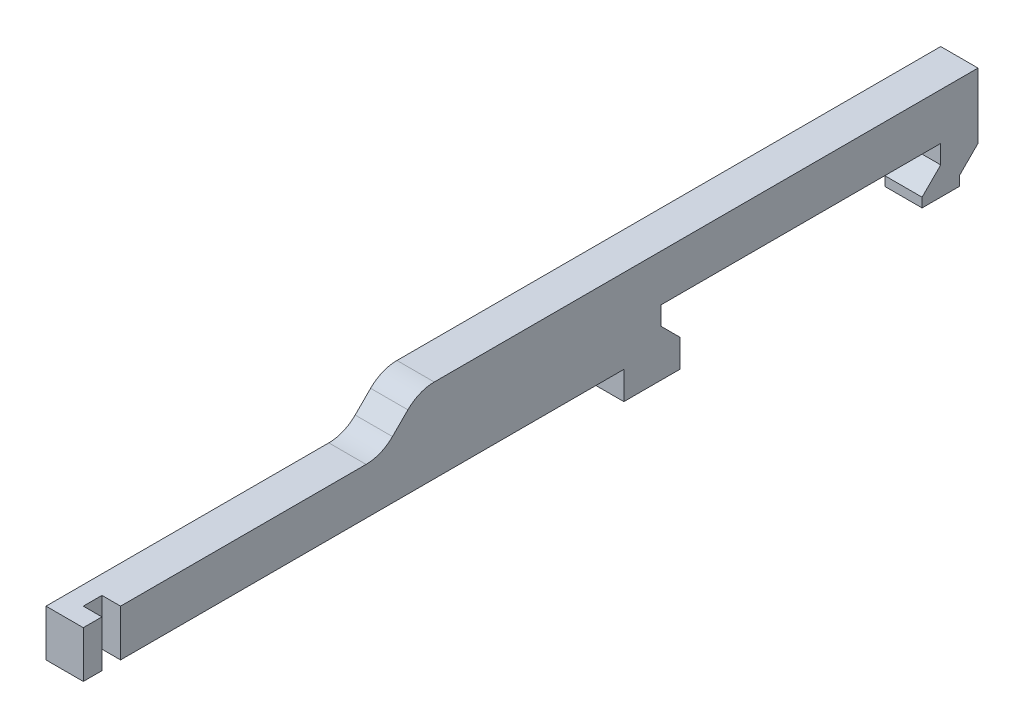
ISO-10303-21;
HEADER;
FILE_DESCRIPTION(('STEP AP214'),'2;1');
FILE_NAME('part.step','',(''),(''),'','','');
FILE_SCHEMA(('AUTOMOTIVE_DESIGN { 1 0 10303 214 1 1 1 1 }'));
ENDSEC;
DATA;
#1=APPLICATION_CONTEXT('core data for automotive mechanical design processes');
#2=APPLICATION_PROTOCOL_DEFINITION('international standard','automotive_design',2000,#1);
#3=PRODUCT_CONTEXT('',#1,'mechanical');
#4=PRODUCT('Part','Part','',(#3));
#5=PRODUCT_RELATED_PRODUCT_CATEGORY('part','',(#4));
#6=PRODUCT_DEFINITION_FORMATION('','',#4);
#7=PRODUCT_DEFINITION_CONTEXT('part definition',#1,'design');
#8=PRODUCT_DEFINITION('design','',#6,#7);
#9=PRODUCT_DEFINITION_SHAPE('','',#8);
#10=(LENGTH_UNIT() NAMED_UNIT(*) SI_UNIT(.MILLI.,.METRE.));
#11=(NAMED_UNIT(*) PLANE_ANGLE_UNIT() SI_UNIT($,.RADIAN.));
#12=(NAMED_UNIT(*) SI_UNIT($,.STERADIAN.) SOLID_ANGLE_UNIT());
#13=UNCERTAINTY_MEASURE_WITH_UNIT(LENGTH_MEASURE(1.E-05),#10,'distance_accuracy_value','');
#14=(GEOMETRIC_REPRESENTATION_CONTEXT(3) GLOBAL_UNCERTAINTY_ASSIGNED_CONTEXT((#13)) GLOBAL_UNIT_ASSIGNED_CONTEXT((#10,
#11,#12)) REPRESENTATION_CONTEXT('',''));
#15=CARTESIAN_POINT('',(0.,0.,0.));
#16=DIRECTION('',(0.,0.,1.));
#17=DIRECTION('',(1.,0.,0.));
#18=AXIS2_PLACEMENT_3D('',#15,#16,#17);
#19=CARTESIAN_POINT('',(2.,0.,0.));
#20=DIRECTION('',(1.,0.,0.));
#21=DIRECTION('',(0.,0.,-1.));
#22=AXIS2_PLACEMENT_3D('',#19,#20,#21);
#23=PLANE('',#22);
#24=DIRECTION('',(0.,-1.,0.));
#25=VECTOR('',#24,1.);
#26=CARTESIAN_POINT('',(2.,0.,-1.));
#27=LINE('',#26,#25);
#28=CARTESIAN_POINT('',(2.,2.5,-1.));
#29=VERTEX_POINT('',#28);
#30=CARTESIAN_POINT('',(2.,0.,-1.));
#31=VERTEX_POINT('',#30);
#32=EDGE_CURVE('E45',#29,#31,#27,.T.);
#33=ORIENTED_EDGE('',*,*,#32,.F.);
#34=DIRECTION('',(0.,0.,-1.));
#35=VECTOR('',#34,1.);
#36=CARTESIAN_POINT('',(2.,2.5,0.));
#37=LINE('',#36,#35);
#38=CARTESIAN_POINT('',(2.,2.5,0.));
#39=VERTEX_POINT('',#38);
#40=EDGE_CURVE('E216',#39,#29,#37,.T.);
#41=ORIENTED_EDGE('',*,*,#40,.F.);
#42=DIRECTION('',(0.,1.,0.));
#43=VECTOR('',#42,1.);
#44=CARTESIAN_POINT('',(2.,0.,0.));
#45=LINE('',#44,#43);
#46=CARTESIAN_POINT('',(2.,0.,0.));
#47=VERTEX_POINT('',#46);
#48=EDGE_CURVE('E220',#47,#39,#45,.T.);
#49=ORIENTED_EDGE('',*,*,#48,.F.);
#50=DIRECTION('',(0.,0.,-1.));
#51=VECTOR('',#50,1.);
#52=CARTESIAN_POINT('',(2.,0.,0.));
#53=LINE('',#52,#51);
#54=EDGE_CURVE('E229',#47,#31,#53,.T.);
#55=ORIENTED_EDGE('',*,*,#54,.T.);
#56=EDGE_LOOP('',(#33,#41,#49,#55));
#57=FACE_BOUND('',#56,.T.);
#58=ADVANCED_FACE('F37',(#57),#23,.T.);
#59=CARTESIAN_POINT('',(2.,0.,-48.));
#60=DIRECTION('',(0.,0.,1.));
#61=DIRECTION('',(1.,0.,0.));
#62=AXIS2_PLACEMENT_3D('',#59,#60,#61);
#63=PLANE('',#62);
#64=DIRECTION('',(0.,1.,0.));
#65=VECTOR('',#64,1.);
#66=CARTESIAN_POINT('',(0.,0.,-48.));
#67=LINE('',#66,#65);
#68=CARTESIAN_POINT('',(0.,0.999999999999997,-48.));
#69=VERTEX_POINT('',#68);
#70=CARTESIAN_POINT('',(0.,4.5,-48.));
#71=VERTEX_POINT('',#70);
#72=EDGE_CURVE('E259',#69,#71,#67,.T.);
#73=ORIENTED_EDGE('',*,*,#72,.T.);
#74=DIRECTION('',(-1.,0.,0.));
#75=VECTOR('',#74,1.);
#76=CARTESIAN_POINT('',(2.,4.5,-48.));
#77=LINE('',#76,#75);
#78=CARTESIAN_POINT('',(2.,4.5,-48.));
#79=VERTEX_POINT('',#78);
#80=EDGE_CURVE('E344',#79,#71,#77,.T.);
#81=ORIENTED_EDGE('',*,*,#80,.F.);
#82=DIRECTION('',(0.,1.,0.));
#83=VECTOR('',#82,1.);
#84=CARTESIAN_POINT('',(2.,0.,-48.));
#85=LINE('',#84,#83);
#86=CARTESIAN_POINT('',(2.,0.999999999999997,-48.));
#87=VERTEX_POINT('',#86);
#88=EDGE_CURVE('E304',#87,#79,#85,.T.);
#89=ORIENTED_EDGE('',*,*,#88,.F.);
#90=DIRECTION('',(-1.,0.,0.));
#91=VECTOR('',#90,1.);
#92=CARTESIAN_POINT('',(2.,0.999999999999997,-48.));
#93=LINE('',#92,#91);
#94=EDGE_CURVE('E258',#87,#69,#93,.T.);
#95=ORIENTED_EDGE('',*,*,#94,.T.);
#96=EDGE_LOOP('',(#73,#81,#89,#95));
#97=FACE_BOUND('',#96,.T.);
#98=ADVANCED_FACE('F431',(#97),#63,.F.);
#99=CARTESIAN_POINT('',(2.,4.5,0.));
#100=DIRECTION('',(0.,-1.,0.));
#101=DIRECTION('',(0.,0.,-1.));
#102=AXIS2_PLACEMENT_3D('',#99,#100,#101);
#103=PLANE('',#102);
#104=DIRECTION('',(0.,0.,1.));
#105=VECTOR('',#104,1.);
#106=CARTESIAN_POINT('',(0.,4.5,0.));
#107=LINE('',#106,#105);
#108=CARTESIAN_POINT('',(0.,4.5,-18.8284271247462));
#109=VERTEX_POINT('',#108);
#110=EDGE_CURVE('E262',#71,#109,#107,.T.);
#111=ORIENTED_EDGE('',*,*,#110,.T.);
#112=DIRECTION('',(-1.,0.,0.));
#113=VECTOR('',#112,1.);
#114=CARTESIAN_POINT('',(2.,4.5,-18.8284271247462));
#115=LINE('',#114,#113);
#116=CARTESIAN_POINT('',(2.,4.5,-18.8284271247462));
#117=VERTEX_POINT('',#116);
#118=EDGE_CURVE('E354',#109,#117,#115,.F.);
#119=ORIENTED_EDGE('',*,*,#118,.T.);
#120=DIRECTION('',(0.,0.,1.));
#121=VECTOR('',#120,1.);
#122=CARTESIAN_POINT('',(2.,4.5,0.));
#123=LINE('',#122,#121);
#124=EDGE_CURVE('E222',#79,#117,#123,.T.);
#125=ORIENTED_EDGE('',*,*,#124,.F.);
#126=ORIENTED_EDGE('',*,*,#80,.T.);
#127=EDGE_LOOP('',(#111,#119,#125,#126));
#128=FACE_BOUND('',#127,.T.);
#129=ADVANCED_FACE('F438',(#128),#103,.F.);
#130=CARTESIAN_POINT('',(2.,-6.75,-6.74999999999999));
#131=DIRECTION('',(0.,0.707106781186548,0.707106781186547));
#132=DIRECTION('',(0.,-0.707106781186547,0.707106781186548));
#133=AXIS2_PLACEMENT_3D('',#130,#131,#132);
#134=PLANE('',#133);
#135=DIRECTION('',(0.,0.707106781186547,-0.707106781186548));
#136=VECTOR('',#135,1.);
#137=CARTESIAN_POINT('',(2.,-6.75,-6.74999999999999));
#138=LINE('',#137,#136);
#139=CARTESIAN_POINT('',(2.,3.0857864376269,-16.5857864376269));
#140=VERTEX_POINT('',#139);
#141=CARTESIAN_POINT('',(2.,3.91421356237309,-17.4142135623731));
#142=VERTEX_POINT('',#141);
#143=EDGE_CURVE('E217',#140,#142,#138,.T.);
#144=ORIENTED_EDGE('',*,*,#143,.T.);
#145=DIRECTION('',(-1.,0.,0.));
#146=VECTOR('',#145,1.);
#147=CARTESIAN_POINT('',(0.,3.91421356237309,-17.4142135623731));
#148=LINE('',#147,#146);
#149=CARTESIAN_POINT('',(0.,3.91421356237309,-17.4142135623731));
#150=VERTEX_POINT('',#149);
#151=EDGE_CURVE('E349',#142,#150,#148,.T.);
#152=ORIENTED_EDGE('',*,*,#151,.T.);
#153=DIRECTION('',(0.,0.707106781186547,-0.707106781186548));
#154=VECTOR('',#153,1.);
#155=CARTESIAN_POINT('',(0.,-6.75,-6.74999999999999));
#156=LINE('',#155,#154);
#157=CARTESIAN_POINT('',(0.,3.0857864376269,-16.5857864376269));
#158=VERTEX_POINT('',#157);
#159=EDGE_CURVE('E266',#158,#150,#156,.T.);
#160=ORIENTED_EDGE('',*,*,#159,.F.);
#161=DIRECTION('',(-1.,0.,0.));
#162=VECTOR('',#161,1.);
#163=CARTESIAN_POINT('',(2.,3.0857864376269,-16.5857864376269));
#164=LINE('',#163,#162);
#165=EDGE_CURVE('E347',#158,#140,#164,.F.);
#166=ORIENTED_EDGE('',*,*,#165,.T.);
#167=EDGE_LOOP('',(#144,#152,#160,#166));
#168=FACE_BOUND('',#167,.T.);
#169=ADVANCED_FACE('F414',(#168),#134,.T.);
#170=CARTESIAN_POINT('',(2.,2.5,0.));
#171=DIRECTION('',(0.,1.,0.));
#172=DIRECTION('',(0.,0.,1.));
#173=AXIS2_PLACEMENT_3D('',#170,#171,#172);
#174=PLANE('',#173);
#175=DIRECTION('',(1.,0.,0.));
#176=VECTOR('',#175,1.);
#177=CARTESIAN_POINT('',(2.,2.5,-1.));
#178=LINE('',#177,#176);
#179=CARTESIAN_POINT('',(1.,2.5,-1.));
#180=VERTEX_POINT('',#179);
#181=EDGE_CURVE('E367',#180,#29,#178,.T.);
#182=ORIENTED_EDGE('',*,*,#181,.F.);
#183=DIRECTION('',(0.,0.,1.));
#184=VECTOR('',#183,1.);
#185=CARTESIAN_POINT('',(1.,2.5,-1.));
#186=LINE('',#185,#184);
#187=CARTESIAN_POINT('',(1.,2.5,-2.));
#188=VERTEX_POINT('',#187);
#189=EDGE_CURVE('E210',#188,#180,#186,.T.);
#190=ORIENTED_EDGE('',*,*,#189,.F.);
#191=DIRECTION('',(-1.,0.,0.));
#192=VECTOR('',#191,1.);
#193=CARTESIAN_POINT('',(2.,2.5,-2.));
#194=LINE('',#193,#192);
#195=CARTESIAN_POINT('',(2.,2.5,-2.));
#196=VERTEX_POINT('',#195);
#197=EDGE_CURVE('E201',#196,#188,#194,.T.);
#198=ORIENTED_EDGE('',*,*,#197,.F.);
#199=CARTESIAN_POINT('',(2.,2.5,-15.1715728752538));
#200=VERTEX_POINT('',#199);
#201=EDGE_CURVE('E60',#196,#200,#37,.T.);
#202=ORIENTED_EDGE('',*,*,#201,.T.);
#203=DIRECTION('',(-1.,0.,0.));
#204=VECTOR('',#203,1.);
#205=CARTESIAN_POINT('',(0.,2.5,-15.1715728752538));
#206=LINE('',#205,#204);
#207=CARTESIAN_POINT('',(0.,2.5,-15.1715728752538));
#208=VERTEX_POINT('',#207);
#209=EDGE_CURVE('E358',#200,#208,#206,.T.);
#210=ORIENTED_EDGE('',*,*,#209,.T.);
#211=DIRECTION('',(0.,0.,-1.));
#212=VECTOR('',#211,1.);
#213=CARTESIAN_POINT('',(0.,2.5,0.));
#214=LINE('',#213,#212);
#215=CARTESIAN_POINT('',(0.,2.5,0.));
#216=VERTEX_POINT('',#215);
#217=EDGE_CURVE('E269',#216,#208,#214,.T.);
#218=ORIENTED_EDGE('',*,*,#217,.F.);
#219=DIRECTION('',(-1.,0.,0.));
#220=VECTOR('',#219,1.);
#221=CARTESIAN_POINT('',(2.,2.5,0.));
#222=LINE('',#221,#220);
#223=EDGE_CURVE('E342',#39,#216,#222,.T.);
#224=ORIENTED_EDGE('',*,*,#223,.F.);
#225=ORIENTED_EDGE('',*,*,#40,.T.);
#226=EDGE_LOOP('',(#182,#190,#198,#202,#210,#218,#224,#225));
#227=FACE_BOUND('',#226,.T.);
#228=ADVANCED_FACE('F208',(#227),#174,.T.);
#229=CARTESIAN_POINT('',(2.,0.,0.));
#230=DIRECTION('',(0.,0.,1.));
#231=DIRECTION('',(1.,0.,0.));
#232=AXIS2_PLACEMENT_3D('',#229,#230,#231);
#233=PLANE('',#232);
#234=DIRECTION('',(0.,1.,0.));
#235=VECTOR('',#234,1.);
#236=CARTESIAN_POINT('',(0.,0.,0.));
#237=LINE('',#236,#235);
#238=CARTESIAN_POINT('',(0.,0.,0.));
#239=VERTEX_POINT('',#238);
#240=EDGE_CURVE('E272',#239,#216,#237,.T.);
#241=ORIENTED_EDGE('',*,*,#240,.F.);
#242=DIRECTION('',(-1.,0.,0.));
#243=VECTOR('',#242,1.);
#244=CARTESIAN_POINT('',(2.,0.,0.));
#245=LINE('',#244,#243);
#246=EDGE_CURVE('E340',#47,#239,#245,.T.);
#247=ORIENTED_EDGE('',*,*,#246,.F.);
#248=ORIENTED_EDGE('',*,*,#48,.T.);
#249=ORIENTED_EDGE('',*,*,#223,.T.);
#250=EDGE_LOOP('',(#241,#247,#248,#249));
#251=FACE_BOUND('',#250,.T.);
#252=ADVANCED_FACE('F377',(#251),#233,.T.);
#253=CARTESIAN_POINT('',(2.,0.,0.));
#254=DIRECTION('',(0.,1.,0.));
#255=DIRECTION('',(0.,0.,1.));
#256=AXIS2_PLACEMENT_3D('',#253,#254,#255);
#257=PLANE('',#256);
#258=DIRECTION('',(0.,0.,1.));
#259=VECTOR('',#258,1.);
#260=CARTESIAN_POINT('',(1.,0.,0.));
#261=LINE('',#260,#259);
#262=CARTESIAN_POINT('',(1.,0.,-2.));
#263=VERTEX_POINT('',#262);
#264=CARTESIAN_POINT('',(1.,0.,-1.));
#265=VERTEX_POINT('',#264);
#266=EDGE_CURVE('E11',#263,#265,#261,.T.);
#267=ORIENTED_EDGE('',*,*,#266,.T.);
#268=DIRECTION('',(1.,0.,0.));
#269=VECTOR('',#268,1.);
#270=CARTESIAN_POINT('',(2.,0.,-1.));
#271=LINE('',#270,#269);
#272=EDGE_CURVE('E263',#265,#31,#271,.T.);
#273=ORIENTED_EDGE('',*,*,#272,.T.);
#274=ORIENTED_EDGE('',*,*,#54,.F.);
#275=ORIENTED_EDGE('',*,*,#246,.T.);
#276=DIRECTION('',(0.,0.,-1.));
#277=VECTOR('',#276,1.);
#278=CARTESIAN_POINT('',(0.,0.,0.));
#279=LINE('',#278,#277);
#280=CARTESIAN_POINT('',(0.,0.,-29.));
#281=VERTEX_POINT('',#280);
#282=EDGE_CURVE('E275',#239,#281,#279,.T.);
#283=ORIENTED_EDGE('',*,*,#282,.T.);
#284=DIRECTION('',(-1.,0.,0.));
#285=VECTOR('',#284,1.);
#286=CARTESIAN_POINT('',(2.,0.,-29.));
#287=LINE('',#286,#285);
#288=CARTESIAN_POINT('',(2.,0.,-29.));
#289=VERTEX_POINT('',#288);
#290=EDGE_CURVE('E337',#289,#281,#287,.T.);
#291=ORIENTED_EDGE('',*,*,#290,.F.);
#292=CARTESIAN_POINT('',(2.,0.,-2.));
#293=VERTEX_POINT('',#292);
#294=EDGE_CURVE('E228',#293,#289,#53,.T.);
#295=ORIENTED_EDGE('',*,*,#294,.F.);
#296=DIRECTION('',(-1.,0.,0.));
#297=VECTOR('',#296,1.);
#298=CARTESIAN_POINT('',(2.,0.,-2.));
#299=LINE('',#298,#297);
#300=EDGE_CURVE('E52',#293,#263,#299,.T.);
#301=ORIENTED_EDGE('',*,*,#300,.T.);
#302=EDGE_LOOP('',(#267,#273,#274,#275,#283,#291,#295,#301));
#303=FACE_BOUND('',#302,.T.);
#304=ADVANCED_FACE('F372',(#303),#257,.F.);
#305=CARTESIAN_POINT('',(2.,0.,-29.));
#306=DIRECTION('',(0.,0.,-1.));
#307=DIRECTION('',(-1.,0.,0.));
#308=AXIS2_PLACEMENT_3D('',#305,#306,#307);
#309=PLANE('',#308);
#310=DIRECTION('',(0.,-1.,0.));
#311=VECTOR('',#310,1.);
#312=CARTESIAN_POINT('',(0.,0.,-29.));
#313=LINE('',#312,#311);
#314=CARTESIAN_POINT('',(0.,-1.5,-29.));
#315=VERTEX_POINT('',#314);
#316=EDGE_CURVE('E277',#281,#315,#313,.T.);
#317=ORIENTED_EDGE('',*,*,#316,.T.);
#318=DIRECTION('',(-1.,0.,0.));
#319=VECTOR('',#318,1.);
#320=CARTESIAN_POINT('',(2.,-1.5,-29.));
#321=LINE('',#320,#319);
#322=CARTESIAN_POINT('',(2.,-1.5,-29.));
#323=VERTEX_POINT('',#322);
#324=EDGE_CURVE('E334',#323,#315,#321,.T.);
#325=ORIENTED_EDGE('',*,*,#324,.F.);
#326=DIRECTION('',(0.,-1.,0.));
#327=VECTOR('',#326,1.);
#328=CARTESIAN_POINT('',(2.,0.,-29.));
#329=LINE('',#328,#327);
#330=EDGE_CURVE('E232',#289,#323,#329,.T.);
#331=ORIENTED_EDGE('',*,*,#330,.F.);
#332=ORIENTED_EDGE('',*,*,#290,.T.);
#333=EDGE_LOOP('',(#317,#325,#331,#332));
#334=FACE_BOUND('',#333,.T.);
#335=ADVANCED_FACE('F388',(#334),#309,.F.);
#336=CARTESIAN_POINT('',(2.,-1.5,0.));
#337=DIRECTION('',(0.,1.,0.));
#338=DIRECTION('',(0.,0.,1.));
#339=AXIS2_PLACEMENT_3D('',#336,#337,#338);
#340=PLANE('',#339);
#341=DIRECTION('',(0.,0.,-1.));
#342=VECTOR('',#341,1.);
#343=CARTESIAN_POINT('',(0.,-1.5,0.));
#344=LINE('',#343,#342);
#345=CARTESIAN_POINT('',(0.,-1.5,-32.));
#346=VERTEX_POINT('',#345);
#347=EDGE_CURVE('E279',#315,#346,#344,.T.);
#348=ORIENTED_EDGE('',*,*,#347,.T.);
#349=DIRECTION('',(-1.,0.,0.));
#350=VECTOR('',#349,1.);
#351=CARTESIAN_POINT('',(2.,-1.5,-32.));
#352=LINE('',#351,#350);
#353=CARTESIAN_POINT('',(2.,-1.5,-32.));
#354=VERTEX_POINT('',#353);
#355=EDGE_CURVE('E331',#354,#346,#352,.T.);
#356=ORIENTED_EDGE('',*,*,#355,.F.);
#357=DIRECTION('',(0.,0.,-1.));
#358=VECTOR('',#357,1.);
#359=CARTESIAN_POINT('',(2.,-1.5,0.));
#360=LINE('',#359,#358);
#361=EDGE_CURVE('E234',#323,#354,#360,.T.);
#362=ORIENTED_EDGE('',*,*,#361,.F.);
#363=ORIENTED_EDGE('',*,*,#324,.T.);
#364=EDGE_LOOP('',(#348,#356,#362,#363));
#365=FACE_BOUND('',#364,.T.);
#366=ADVANCED_FACE('F392',(#365),#340,.F.);
#367=CARTESIAN_POINT('',(2.,0.,-32.));
#368=DIRECTION('',(0.,0.,1.));
#369=DIRECTION('',(1.,0.,0.));
#370=AXIS2_PLACEMENT_3D('',#367,#368,#369);
#371=PLANE('',#370);
#372=DIRECTION('',(0.,1.,0.));
#373=VECTOR('',#372,1.);
#374=CARTESIAN_POINT('',(0.,0.,-32.));
#375=LINE('',#374,#373);
#376=CARTESIAN_POINT('',(0.,0.,-32.));
#377=VERTEX_POINT('',#376);
#378=EDGE_CURVE('E281',#346,#377,#375,.T.);
#379=ORIENTED_EDGE('',*,*,#378,.T.);
#380=DIRECTION('',(-1.,0.,0.));
#381=VECTOR('',#380,1.);
#382=CARTESIAN_POINT('',(2.,0.,-32.));
#383=LINE('',#382,#381);
#384=CARTESIAN_POINT('',(2.,0.,-32.));
#385=VERTEX_POINT('',#384);
#386=EDGE_CURVE('E328',#385,#377,#383,.T.);
#387=ORIENTED_EDGE('',*,*,#386,.F.);
#388=DIRECTION('',(0.,1.,0.));
#389=VECTOR('',#388,1.);
#390=CARTESIAN_POINT('',(2.,0.,-32.));
#391=LINE('',#390,#389);
#392=EDGE_CURVE('E236',#354,#385,#391,.T.);
#393=ORIENTED_EDGE('',*,*,#392,.F.);
#394=ORIENTED_EDGE('',*,*,#355,.T.);
#395=EDGE_LOOP('',(#379,#387,#393,#394));
#396=FACE_BOUND('',#395,.T.);
#397=ADVANCED_FACE('F485',(#396),#371,.F.);
#398=CARTESIAN_POINT('',(2.,16.,-16.));
#399=DIRECTION('',(0.,-0.707106781186548,0.707106781186547));
#400=DIRECTION('',(0.,-0.707106781186547,-0.707106781186548));
#401=AXIS2_PLACEMENT_3D('',#398,#399,#400);
#402=PLANE('',#401);
#403=DIRECTION('',(0.,0.707106781186547,0.707106781186548));
#404=VECTOR('',#403,1.);
#405=CARTESIAN_POINT('',(0.,16.,-16.));
#406=LINE('',#405,#404);
#407=CARTESIAN_POINT('',(0.,1.,-31.));
#408=VERTEX_POINT('',#407);
#409=EDGE_CURVE('E283',#377,#408,#406,.T.);
#410=ORIENTED_EDGE('',*,*,#409,.T.);
#411=DIRECTION('',(-1.,0.,0.));
#412=VECTOR('',#411,1.);
#413=CARTESIAN_POINT('',(2.,1.,-31.));
#414=LINE('',#413,#412);
#415=CARTESIAN_POINT('',(2.,1.,-31.));
#416=VERTEX_POINT('',#415);
#417=EDGE_CURVE('E325',#416,#408,#414,.T.);
#418=ORIENTED_EDGE('',*,*,#417,.F.);
#419=DIRECTION('',(0.,0.707106781186547,0.707106781186548));
#420=VECTOR('',#419,1.);
#421=CARTESIAN_POINT('',(2.,16.,-16.));
#422=LINE('',#421,#420);
#423=EDGE_CURVE('E238',#385,#416,#422,.T.);
#424=ORIENTED_EDGE('',*,*,#423,.F.);
#425=ORIENTED_EDGE('',*,*,#386,.T.);
#426=EDGE_LOOP('',(#410,#418,#424,#425));
#427=FACE_BOUND('',#426,.T.);
#428=ADVANCED_FACE('F481',(#427),#402,.F.);
#429=CARTESIAN_POINT('',(2.,0.,-31.));
#430=DIRECTION('',(0.,0.,1.));
#431=DIRECTION('',(1.,0.,0.));
#432=AXIS2_PLACEMENT_3D('',#429,#430,#431);
#433=PLANE('',#432);
#434=DIRECTION('',(0.,1.,0.));
#435=VECTOR('',#434,1.);
#436=CARTESIAN_POINT('',(0.,0.,-31.));
#437=LINE('',#436,#435);
#438=CARTESIAN_POINT('',(0.,2.,-31.));
#439=VERTEX_POINT('',#438);
#440=EDGE_CURVE('E285',#408,#439,#437,.T.);
#441=ORIENTED_EDGE('',*,*,#440,.T.);
#442=DIRECTION('',(-1.,0.,0.));
#443=VECTOR('',#442,1.);
#444=CARTESIAN_POINT('',(2.,2.,-31.));
#445=LINE('',#444,#443);
#446=CARTESIAN_POINT('',(2.,2.,-31.));
#447=VERTEX_POINT('',#446);
#448=EDGE_CURVE('E322',#447,#439,#445,.T.);
#449=ORIENTED_EDGE('',*,*,#448,.F.);
#450=DIRECTION('',(0.,1.,0.));
#451=VECTOR('',#450,1.);
#452=CARTESIAN_POINT('',(2.,0.,-31.));
#453=LINE('',#452,#451);
#454=EDGE_CURVE('E240',#416,#447,#453,.T.);
#455=ORIENTED_EDGE('',*,*,#454,.F.);
#456=ORIENTED_EDGE('',*,*,#417,.T.);
#457=EDGE_LOOP('',(#441,#449,#455,#456));
#458=FACE_BOUND('',#457,.T.);
#459=ADVANCED_FACE('F477',(#458),#433,.F.);
#460=CARTESIAN_POINT('',(2.,2.,0.));
#461=DIRECTION('',(0.,1.,0.));
#462=DIRECTION('',(0.,0.,1.));
#463=AXIS2_PLACEMENT_3D('',#460,#461,#462);
#464=PLANE('',#463);
#465=DIRECTION('',(0.,0.,-1.));
#466=VECTOR('',#465,1.);
#467=CARTESIAN_POINT('',(0.,2.,0.));
#468=LINE('',#467,#466);
#469=CARTESIAN_POINT('',(0.,2.,-46.));
#470=VERTEX_POINT('',#469);
#471=EDGE_CURVE('E287',#439,#470,#468,.T.);
#472=ORIENTED_EDGE('',*,*,#471,.T.);
#473=DIRECTION('',(-1.,0.,0.));
#474=VECTOR('',#473,1.);
#475=CARTESIAN_POINT('',(2.,2.,-46.));
#476=LINE('',#475,#474);
#477=CARTESIAN_POINT('',(2.,2.,-46.));
#478=VERTEX_POINT('',#477);
#479=EDGE_CURVE('E320',#478,#470,#476,.T.);
#480=ORIENTED_EDGE('',*,*,#479,.F.);
#481=DIRECTION('',(0.,0.,-1.));
#482=VECTOR('',#481,1.);
#483=CARTESIAN_POINT('',(2.,2.,0.));
#484=LINE('',#483,#482);
#485=EDGE_CURVE('E242',#447,#478,#484,.T.);
#486=ORIENTED_EDGE('',*,*,#485,.F.);
#487=ORIENTED_EDGE('',*,*,#448,.T.);
#488=EDGE_LOOP('',(#472,#480,#486,#487));
#489=FACE_BOUND('',#488,.T.);
#490=ADVANCED_FACE('F473',(#489),#464,.F.);
#491=CARTESIAN_POINT('',(2.,0.,-46.));
#492=DIRECTION('',(0.,0.,1.));
#493=DIRECTION('',(1.,0.,0.));
#494=AXIS2_PLACEMENT_3D('',#491,#492,#493);
#495=PLANE('',#494);
#496=DIRECTION('',(0.,1.,0.));
#497=VECTOR('',#496,1.);
#498=CARTESIAN_POINT('',(0.,0.,-46.));
#499=LINE('',#498,#497);
#500=CARTESIAN_POINT('',(0.,1.,-46.));
#501=VERTEX_POINT('',#500);
#502=EDGE_CURVE('E290',#501,#470,#499,.T.);
#503=ORIENTED_EDGE('',*,*,#502,.F.);
#504=DIRECTION('',(-1.,0.,0.));
#505=VECTOR('',#504,1.);
#506=CARTESIAN_POINT('',(2.,1.,-46.));
#507=LINE('',#506,#505);
#508=CARTESIAN_POINT('',(2.,1.,-46.));
#509=VERTEX_POINT('',#508);
#510=EDGE_CURVE('E318',#509,#501,#507,.T.);
#511=ORIENTED_EDGE('',*,*,#510,.F.);
#512=DIRECTION('',(0.,1.,0.));
#513=VECTOR('',#512,1.);
#514=CARTESIAN_POINT('',(2.,0.,-46.));
#515=LINE('',#514,#513);
#516=EDGE_CURVE('E244',#509,#478,#515,.T.);
#517=ORIENTED_EDGE('',*,*,#516,.T.);
#518=ORIENTED_EDGE('',*,*,#479,.T.);
#519=EDGE_LOOP('',(#503,#511,#517,#518));
#520=FACE_BOUND('',#519,.T.);
#521=ADVANCED_FACE('F469',(#520),#495,.T.);
#522=CARTESIAN_POINT('',(2.,-22.5,-22.5));
#523=DIRECTION('',(0.,0.707106781186547,0.707106781186547));
#524=DIRECTION('',(0.,-0.707106781186548,0.707106781186548));
#525=AXIS2_PLACEMENT_3D('',#522,#523,#524);
#526=PLANE('',#525);
#527=DIRECTION('',(0.,0.707106781186548,-0.707106781186548));
#528=VECTOR('',#527,1.);
#529=CARTESIAN_POINT('',(0.,-22.5,-22.5));
#530=LINE('',#529,#528);
#531=CARTESIAN_POINT('',(0.,0.,-45.));
#532=VERTEX_POINT('',#531);
#533=EDGE_CURVE('E293',#532,#501,#530,.T.);
#534=ORIENTED_EDGE('',*,*,#533,.F.);
#535=DIRECTION('',(-1.,0.,0.));
#536=VECTOR('',#535,1.);
#537=CARTESIAN_POINT('',(2.,0.,-45.));
#538=LINE('',#537,#536);
#539=CARTESIAN_POINT('',(2.,0.,-45.));
#540=VERTEX_POINT('',#539);
#541=EDGE_CURVE('E316',#540,#532,#538,.T.);
#542=ORIENTED_EDGE('',*,*,#541,.F.);
#543=DIRECTION('',(0.,0.707106781186548,-0.707106781186548));
#544=VECTOR('',#543,1.);
#545=CARTESIAN_POINT('',(2.,-22.5,-22.5));
#546=LINE('',#545,#544);
#547=EDGE_CURVE('E247',#540,#509,#546,.T.);
#548=ORIENTED_EDGE('',*,*,#547,.T.);
#549=ORIENTED_EDGE('',*,*,#510,.T.);
#550=EDGE_LOOP('',(#534,#542,#548,#549));
#551=FACE_BOUND('',#550,.T.);
#552=ADVANCED_FACE('F465',(#551),#526,.T.);
#553=CARTESIAN_POINT('',(2.,0.,-45.));
#554=DIRECTION('',(0.,0.,-1.));
#555=DIRECTION('',(-1.,0.,0.));
#556=AXIS2_PLACEMENT_3D('',#553,#554,#555);
#557=PLANE('',#556);
#558=DIRECTION('',(0.,-1.,0.));
#559=VECTOR('',#558,1.);
#560=CARTESIAN_POINT('',(0.,0.,-45.));
#561=LINE('',#560,#559);
#562=CARTESIAN_POINT('',(0.,-0.499999999999998,-45.));
#563=VERTEX_POINT('',#562);
#564=EDGE_CURVE('E296',#532,#563,#561,.T.);
#565=ORIENTED_EDGE('',*,*,#564,.T.);
#566=DIRECTION('',(-1.,0.,0.));
#567=VECTOR('',#566,1.);
#568=CARTESIAN_POINT('',(2.,-0.499999999999998,-45.));
#569=LINE('',#568,#567);
#570=CARTESIAN_POINT('',(2.,-0.499999999999998,-45.));
#571=VERTEX_POINT('',#570);
#572=EDGE_CURVE('E313',#571,#563,#569,.T.);
#573=ORIENTED_EDGE('',*,*,#572,.F.);
#574=DIRECTION('',(0.,-1.,0.));
#575=VECTOR('',#574,1.);
#576=CARTESIAN_POINT('',(2.,0.,-45.));
#577=LINE('',#576,#575);
#578=EDGE_CURVE('E250',#540,#571,#577,.T.);
#579=ORIENTED_EDGE('',*,*,#578,.F.);
#580=ORIENTED_EDGE('',*,*,#541,.T.);
#581=EDGE_LOOP('',(#565,#573,#579,#580));
#582=FACE_BOUND('',#581,.T.);
#583=ADVANCED_FACE('F461',(#582),#557,.F.);
#584=CARTESIAN_POINT('',(2.,-0.499999999999998,0.));
#585=DIRECTION('',(0.,1.,0.));
#586=DIRECTION('',(0.,0.,1.));
#587=AXIS2_PLACEMENT_3D('',#584,#585,#586);
#588=PLANE('',#587);
#589=DIRECTION('',(0.,0.,-1.));
#590=VECTOR('',#589,1.);
#591=CARTESIAN_POINT('',(0.,-0.499999999999998,0.));
#592=LINE('',#591,#590);
#593=CARTESIAN_POINT('',(0.,-0.499999999999998,-47.));
#594=VERTEX_POINT('',#593);
#595=EDGE_CURVE('E298',#563,#594,#592,.T.);
#596=ORIENTED_EDGE('',*,*,#595,.T.);
#597=DIRECTION('',(-1.,0.,0.));
#598=VECTOR('',#597,1.);
#599=CARTESIAN_POINT('',(2.,-0.499999999999998,-47.));
#600=LINE('',#599,#598);
#601=CARTESIAN_POINT('',(2.,-0.499999999999998,-47.));
#602=VERTEX_POINT('',#601);
#603=EDGE_CURVE('E310',#602,#594,#600,.T.);
#604=ORIENTED_EDGE('',*,*,#603,.F.);
#605=DIRECTION('',(0.,0.,-1.));
#606=VECTOR('',#605,1.);
#607=CARTESIAN_POINT('',(2.,-0.499999999999998,0.));
#608=LINE('',#607,#606);
#609=EDGE_CURVE('E252',#571,#602,#608,.T.);
#610=ORIENTED_EDGE('',*,*,#609,.F.);
#611=ORIENTED_EDGE('',*,*,#572,.T.);
#612=EDGE_LOOP('',(#596,#604,#610,#611));
#613=FACE_BOUND('',#612,.T.);
#614=ADVANCED_FACE('F455',(#613),#588,.F.);
#615=CARTESIAN_POINT('',(2.,0.,-47.));
#616=DIRECTION('',(0.,0.,1.));
#617=DIRECTION('',(1.,0.,0.));
#618=AXIS2_PLACEMENT_3D('',#615,#616,#617);
#619=PLANE('',#618);
#620=DIRECTION('',(0.,1.,0.));
#621=VECTOR('',#620,1.);
#622=CARTESIAN_POINT('',(0.,0.,-47.));
#623=LINE('',#622,#621);
#624=CARTESIAN_POINT('',(0.,0.,-47.));
#625=VERTEX_POINT('',#624);
#626=EDGE_CURVE('E300',#594,#625,#623,.T.);
#627=ORIENTED_EDGE('',*,*,#626,.T.);
#628=DIRECTION('',(-1.,0.,0.));
#629=VECTOR('',#628,1.);
#630=CARTESIAN_POINT('',(2.,0.,-47.));
#631=LINE('',#630,#629);
#632=CARTESIAN_POINT('',(2.,0.,-47.));
#633=VERTEX_POINT('',#632);
#634=EDGE_CURVE('E307',#633,#625,#631,.T.);
#635=ORIENTED_EDGE('',*,*,#634,.F.);
#636=DIRECTION('',(0.,1.,0.));
#637=VECTOR('',#636,1.);
#638=CARTESIAN_POINT('',(2.,0.,-47.));
#639=LINE('',#638,#637);
#640=EDGE_CURVE('E254',#602,#633,#639,.T.);
#641=ORIENTED_EDGE('',*,*,#640,.F.);
#642=ORIENTED_EDGE('',*,*,#603,.T.);
#643=EDGE_LOOP('',(#627,#635,#641,#642));
#644=FACE_BOUND('',#643,.T.);
#645=ADVANCED_FACE('F449',(#644),#619,.F.);
#646=CARTESIAN_POINT('',(2.,-23.5,-23.5));
#647=DIRECTION('',(0.,0.707106781186547,0.707106781186548));
#648=DIRECTION('',(0.,-0.707106781186548,0.707106781186547));
#649=AXIS2_PLACEMENT_3D('',#646,#647,#648);
#650=PLANE('',#649);
#651=DIRECTION('',(0.,0.707106781186548,-0.707106781186547));
#652=VECTOR('',#651,1.);
#653=CARTESIAN_POINT('',(0.,-23.5,-23.5));
#654=LINE('',#653,#652);
#655=EDGE_CURVE('E302',#625,#69,#654,.T.);
#656=ORIENTED_EDGE('',*,*,#655,.T.);
#657=ORIENTED_EDGE('',*,*,#94,.F.);
#658=DIRECTION('',(0.,0.707106781186548,-0.707106781186547));
#659=VECTOR('',#658,1.);
#660=CARTESIAN_POINT('',(2.,-23.5,-23.5));
#661=LINE('',#660,#659);
#662=EDGE_CURVE('E256',#633,#87,#661,.T.);
#663=ORIENTED_EDGE('',*,*,#662,.F.);
#664=ORIENTED_EDGE('',*,*,#634,.T.);
#665=EDGE_LOOP('',(#656,#657,#663,#664));
#666=FACE_BOUND('',#665,.T.);
#667=ADVANCED_FACE('F443',(#666),#650,.F.);
#668=DIRECTION('',(0.,1.,0.));
#669=VECTOR('',#668,1.);
#670=CARTESIAN_POINT('',(2.,0.,-2.));
#671=LINE('',#670,#669);
#672=EDGE_CURVE('E199',#293,#196,#671,.T.);
#673=ORIENTED_EDGE('',*,*,#672,.F.);
#674=ORIENTED_EDGE('',*,*,#294,.T.);
#675=ORIENTED_EDGE('',*,*,#330,.T.);
#676=ORIENTED_EDGE('',*,*,#361,.T.);
#677=ORIENTED_EDGE('',*,*,#392,.T.);
#678=ORIENTED_EDGE('',*,*,#423,.T.);
#679=ORIENTED_EDGE('',*,*,#454,.T.);
#680=ORIENTED_EDGE('',*,*,#485,.T.);
#681=ORIENTED_EDGE('',*,*,#516,.F.);
#682=ORIENTED_EDGE('',*,*,#547,.F.);
#683=ORIENTED_EDGE('',*,*,#578,.T.);
#684=ORIENTED_EDGE('',*,*,#609,.T.);
#685=ORIENTED_EDGE('',*,*,#640,.T.);
#686=ORIENTED_EDGE('',*,*,#662,.T.);
#687=ORIENTED_EDGE('',*,*,#88,.T.);
#688=ORIENTED_EDGE('',*,*,#124,.T.);
#689=CARTESIAN_POINT('',(2.,2.5,-18.8284271247462));
#690=DIRECTION('',(1.,0.,0.));
#691=DIRECTION('',(0.,0.,-1.));
#692=AXIS2_PLACEMENT_3D('',#689,#690,#691);
#693=CIRCLE('',#692,2.);
#694=EDGE_CURVE('E356',#117,#142,#693,.T.);
#695=ORIENTED_EDGE('',*,*,#694,.T.);
#696=ORIENTED_EDGE('',*,*,#143,.F.);
#697=CARTESIAN_POINT('',(2.,4.5,-15.1715728752538));
#698=DIRECTION('',(1.,0.,0.));
#699=DIRECTION('',(0.,0.,-1.));
#700=AXIS2_PLACEMENT_3D('',#697,#698,#699);
#701=CIRCLE('',#700,2.);
#702=EDGE_CURVE('E205',#140,#200,#701,.F.);
#703=ORIENTED_EDGE('',*,*,#702,.T.);
#704=ORIENTED_EDGE('',*,*,#201,.F.);
#705=EDGE_LOOP('',(#673,#674,#675,#676,#677,#678,#679,#680,#681,#682,#683,#684,#685,#686,#687,
#688,#695,#696,#703,#704));
#706=FACE_BOUND('',#705,.T.);
#707=ADVANCED_FACE('F212',(#706),#23,.T.);
#708=CARTESIAN_POINT('',(0.,0.,0.));
#709=DIRECTION('',(1.,0.,0.));
#710=DIRECTION('',(0.,0.,-1.));
#711=AXIS2_PLACEMENT_3D('',#708,#709,#710);
#712=PLANE('',#711);
#713=ORIENTED_EDGE('',*,*,#159,.T.);
#714=CARTESIAN_POINT('',(0.,2.5,-18.8284271247462));
#715=DIRECTION('',(1.,0.,0.));
#716=DIRECTION('',(0.,0.,-1.));
#717=AXIS2_PLACEMENT_3D('',#714,#715,#716);
#718=CIRCLE('',#717,2.);
#719=EDGE_CURVE('E352',#150,#109,#718,.F.);
#720=ORIENTED_EDGE('',*,*,#719,.T.);
#721=ORIENTED_EDGE('',*,*,#110,.F.);
#722=ORIENTED_EDGE('',*,*,#72,.F.);
#723=ORIENTED_EDGE('',*,*,#655,.F.);
#724=ORIENTED_EDGE('',*,*,#626,.F.);
#725=ORIENTED_EDGE('',*,*,#595,.F.);
#726=ORIENTED_EDGE('',*,*,#564,.F.);
#727=ORIENTED_EDGE('',*,*,#533,.T.);
#728=ORIENTED_EDGE('',*,*,#502,.T.);
#729=ORIENTED_EDGE('',*,*,#471,.F.);
#730=ORIENTED_EDGE('',*,*,#440,.F.);
#731=ORIENTED_EDGE('',*,*,#409,.F.);
#732=ORIENTED_EDGE('',*,*,#378,.F.);
#733=ORIENTED_EDGE('',*,*,#347,.F.);
#734=ORIENTED_EDGE('',*,*,#316,.F.);
#735=ORIENTED_EDGE('',*,*,#282,.F.);
#736=ORIENTED_EDGE('',*,*,#240,.T.);
#737=ORIENTED_EDGE('',*,*,#217,.T.);
#738=CARTESIAN_POINT('',(0.,4.5,-15.1715728752538));
#739=DIRECTION('',(1.,0.,0.));
#740=DIRECTION('',(0.,0.,-1.));
#741=AXIS2_PLACEMENT_3D('',#738,#739,#740);
#742=CIRCLE('',#741,2.);
#743=EDGE_CURVE('E360',#208,#158,#742,.T.);
#744=ORIENTED_EDGE('',*,*,#743,.T.);
#745=EDGE_LOOP('',(#713,#720,#721,#722,#723,#724,#725,#726,#727,#728,#729,#730,#731,#732,#733,
#734,#735,#736,#737,#744));
#746=FACE_BOUND('',#745,.T.);
#747=ADVANCED_FACE('F383',(#746),#712,.F.);
#748=CARTESIAN_POINT('',(2.,2.5,-18.8284271247462));
#749=DIRECTION('',(1.,0.,0.));
#750=DIRECTION('',(0.,0.,-1.));
#751=AXIS2_PLACEMENT_3D('',#748,#749,#750);
#752=CYLINDRICAL_SURFACE('',#751,2.);
#753=ORIENTED_EDGE('',*,*,#694,.F.);
#754=ORIENTED_EDGE('',*,*,#118,.F.);
#755=ORIENTED_EDGE('',*,*,#719,.F.);
#756=ORIENTED_EDGE('',*,*,#151,.F.);
#757=EDGE_LOOP('',(#753,#754,#755,#756));
#758=FACE_BOUND('',#757,.T.);
#759=ADVANCED_FACE('F411',(#758),#752,.T.);
#760=CARTESIAN_POINT('',(2.,4.5,-15.1715728752538));
#761=DIRECTION('',(1.,0.,0.));
#762=DIRECTION('',(0.,0.,-1.));
#763=AXIS2_PLACEMENT_3D('',#760,#761,#762);
#764=CYLINDRICAL_SURFACE('',#763,2.);
#765=ORIENTED_EDGE('',*,*,#702,.F.);
#766=ORIENTED_EDGE('',*,*,#165,.F.);
#767=ORIENTED_EDGE('',*,*,#743,.F.);
#768=ORIENTED_EDGE('',*,*,#209,.F.);
#769=EDGE_LOOP('',(#765,#766,#767,#768));
#770=FACE_BOUND('',#769,.T.);
#771=ADVANCED_FACE('F39',(#770),#764,.F.);
#772=CARTESIAN_POINT('',(1.,-1.5,-1.));
#773=DIRECTION('',(-1.,0.,0.));
#774=DIRECTION('',(0.,0.,1.));
#775=AXIS2_PLACEMENT_3D('',#772,#773,#774);
#776=PLANE('',#775);
#777=DIRECTION('',(0.,1.,0.));
#778=VECTOR('',#777,1.);
#779=CARTESIAN_POINT('',(1.,-1.5,-2.));
#780=LINE('',#779,#778);
#781=EDGE_CURVE('E398',#263,#188,#780,.T.);
#782=ORIENTED_EDGE('',*,*,#781,.T.);
#783=ORIENTED_EDGE('',*,*,#189,.T.);
#784=DIRECTION('',(0.,1.,0.));
#785=VECTOR('',#784,1.);
#786=CARTESIAN_POINT('',(1.,-1.5,-1.));
#787=LINE('',#786,#785);
#788=EDGE_CURVE('E396',#265,#180,#787,.T.);
#789=ORIENTED_EDGE('',*,*,#788,.F.);
#790=ORIENTED_EDGE('',*,*,#266,.F.);
#791=EDGE_LOOP('',(#782,#783,#789,#790));
#792=FACE_BOUND('',#791,.T.);
#793=ADVANCED_FACE('F420',(#792),#776,.F.);
#794=CARTESIAN_POINT('',(2.,-1.5,-1.));
#795=DIRECTION('',(0.,0.,1.));
#796=DIRECTION('',(1.,0.,0.));
#797=AXIS2_PLACEMENT_3D('',#794,#795,#796);
#798=PLANE('',#797);
#799=ORIENTED_EDGE('',*,*,#788,.T.);
#800=ORIENTED_EDGE('',*,*,#181,.T.);
#801=ORIENTED_EDGE('',*,*,#32,.T.);
#802=ORIENTED_EDGE('',*,*,#272,.F.);
#803=EDGE_LOOP('',(#799,#800,#801,#802));
#804=FACE_BOUND('',#803,.T.);
#805=ADVANCED_FACE('F365',(#804),#798,.F.);
#806=CARTESIAN_POINT('',(2.,-1.5,-2.));
#807=DIRECTION('',(0.,0.,-1.));
#808=DIRECTION('',(0.,1.,0.));
#809=AXIS2_PLACEMENT_3D('',#806,#807,#808);
#810=PLANE('',#809);
#811=ORIENTED_EDGE('',*,*,#672,.T.);
#812=ORIENTED_EDGE('',*,*,#197,.T.);
#813=ORIENTED_EDGE('',*,*,#781,.F.);
#814=ORIENTED_EDGE('',*,*,#300,.F.);
#815=EDGE_LOOP('',(#811,#812,#813,#814));
#816=FACE_BOUND('',#815,.T.);
#817=ADVANCED_FACE('F200',(#816),#810,.F.);
#818=CLOSED_SHELL('',(#58,#98,#129,#169,#228,#252,#304,#335,#366,#397,#428,#459,#490,#521,#552,
#583,#614,#645,#667,#707,#747,#759,#771,#793,#805,#817));
#819=MANIFOLD_SOLID_BREP('B2',#818);
#820=ADVANCED_BREP_SHAPE_REPRESENTATION('',(#18,#819),#14);
#821=SHAPE_DEFINITION_REPRESENTATION(#9,#820);
ENDSEC;
END-ISO-10303-21;
